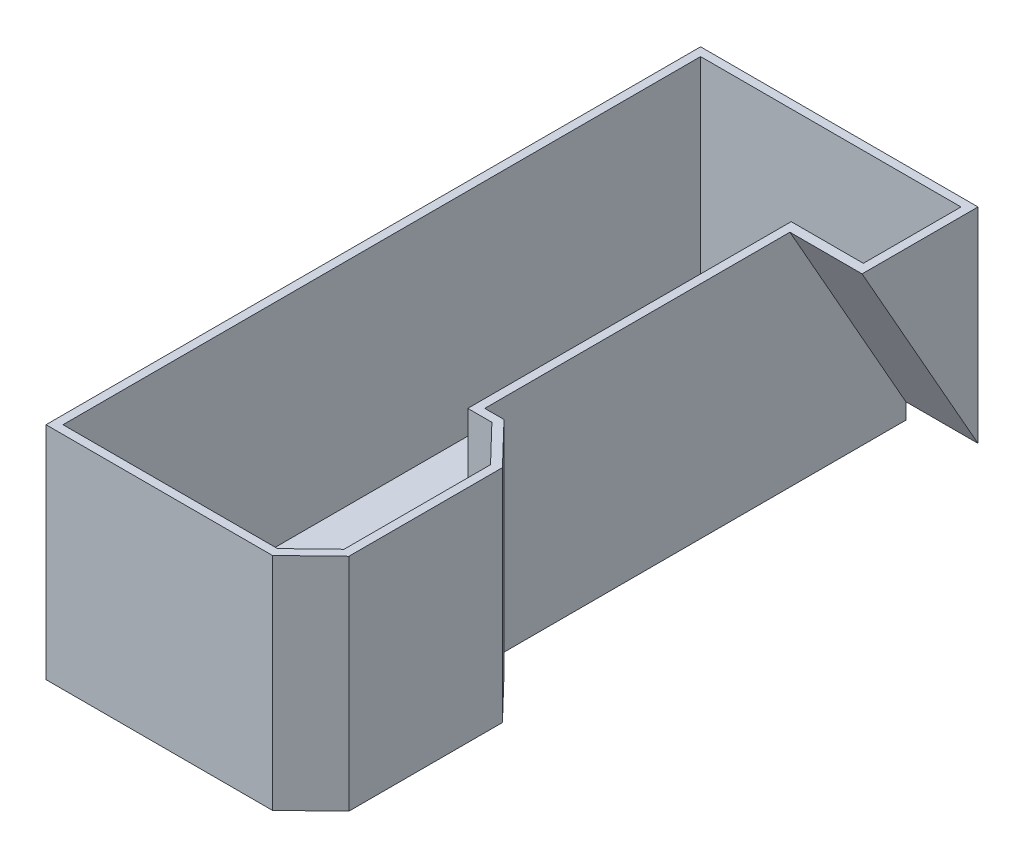
ISO-10303-21;
HEADER;
FILE_DESCRIPTION(('STEP AP214'),'2;1');
FILE_NAME('part.step','',(''),(''),'','','');
FILE_SCHEMA(('AUTOMOTIVE_DESIGN { 1 0 10303 214 1 1 1 1 }'));
ENDSEC;
DATA;
#1=APPLICATION_CONTEXT('core data for automotive mechanical design processes');
#2=APPLICATION_PROTOCOL_DEFINITION('international standard','automotive_design',2000,#1);
#3=PRODUCT_CONTEXT('',#1,'mechanical');
#4=PRODUCT('Part','Part','',(#3));
#5=PRODUCT_RELATED_PRODUCT_CATEGORY('part','',(#4));
#6=PRODUCT_DEFINITION_FORMATION('','',#4);
#7=PRODUCT_DEFINITION_CONTEXT('part definition',#1,'design');
#8=PRODUCT_DEFINITION('design','',#6,#7);
#9=PRODUCT_DEFINITION_SHAPE('','',#8);
#10=(LENGTH_UNIT() NAMED_UNIT(*) SI_UNIT(.MILLI.,.METRE.));
#11=(NAMED_UNIT(*) PLANE_ANGLE_UNIT() SI_UNIT($,.RADIAN.));
#12=(NAMED_UNIT(*) SI_UNIT($,.STERADIAN.) SOLID_ANGLE_UNIT());
#13=UNCERTAINTY_MEASURE_WITH_UNIT(LENGTH_MEASURE(1.E-05),#10,'distance_accuracy_value','');
#14=(GEOMETRIC_REPRESENTATION_CONTEXT(3) GLOBAL_UNCERTAINTY_ASSIGNED_CONTEXT((#13)) GLOBAL_UNIT_ASSIGNED_CONTEXT((#10,
#11,#12)) REPRESENTATION_CONTEXT('',''));
#15=CARTESIAN_POINT('',(0.,0.,0.));
#16=DIRECTION('',(0.,0.,1.));
#17=DIRECTION('',(1.,0.,0.));
#18=AXIS2_PLACEMENT_3D('',#15,#16,#17);
#19=CARTESIAN_POINT('',(278.,312.,-775.));
#20=DIRECTION('',(0.,-0.49259821985177,0.87025685507146));
#21=DIRECTION('',(0.,-0.87025685507146,-0.49259821985177));
#22=AXIS2_PLACEMENT_3D('',#19,#20,#21);
#23=PLANE('',#22);
#24=DIRECTION('',(-1.,0.,0.));
#25=VECTOR('',#24,1.);
#26=CARTESIAN_POINT('',(380.,68.2,-913.));
#27=LINE('',#26,#25);
#28=CARTESIAN_POINT('',(380.,68.2,-913.));
#29=VERTEX_POINT('',#28);
#30=CARTESIAN_POINT('',(278.,68.2,-913.));
#31=VERTEX_POINT('',#30);
#32=EDGE_CURVE('E56',#29,#31,#27,.T.);
#33=ORIENTED_EDGE('',*,*,#32,.T.);
#34=DIRECTION('',(0.,-0.87025685507146,-0.49259821985177));
#35=VECTOR('',#34,1.);
#36=CARTESIAN_POINT('',(278.,312.,-775.));
#37=LINE('',#36,#35);
#38=CARTESIAN_POINT('',(278.,312.,-775.));
#39=VERTEX_POINT('',#38);
#40=EDGE_CURVE('E217',#39,#31,#37,.T.);
#41=ORIENTED_EDGE('',*,*,#40,.F.);
#42=DIRECTION('',(1.,0.,0.));
#43=VECTOR('',#42,1.);
#44=CARTESIAN_POINT('',(278.,312.,-775.));
#45=LINE('',#44,#43);
#46=CARTESIAN_POINT('',(380.,312.,-775.));
#47=VERTEX_POINT('',#46);
#48=EDGE_CURVE('E219',#39,#47,#45,.T.);
#49=ORIENTED_EDGE('',*,*,#48,.T.);
#50=DIRECTION('',(0.,0.87025685507146,0.49259821985177));
#51=VECTOR('',#50,1.);
#52=CARTESIAN_POINT('',(380.,312.,-775.));
#53=LINE('',#52,#51);
#54=EDGE_CURVE('E190',#29,#47,#53,.T.);
#55=ORIENTED_EDGE('',*,*,#54,.F.);
#56=EDGE_LOOP('',(#33,#41,#49,#55));
#57=FACE_BOUND('',#56,.T.);
#58=ADVANCED_FACE('F41',(#57),#23,.F.);
#59=CARTESIAN_POINT('',(290.,12.,0.));
#60=DIRECTION('',(-1.,0.,0.));
#61=DIRECTION('',(0.,0.,1.));
#62=AXIS2_PLACEMENT_3D('',#59,#60,#61);
#63=PLANE('',#62);
#64=DIRECTION('',(0.,-0.87025685507146,-0.49259821985177));
#65=VECTOR('',#64,1.);
#66=CARTESIAN_POINT('',(290.,22.6393760342639,-925.));
#67=LINE('',#66,#65);
#68=CARTESIAN_POINT('',(290.,312.,-761.210967566564));
#69=VERTEX_POINT('',#68);
#70=CARTESIAN_POINT('',(290.,22.6393760342639,-925.));
#71=VERTEX_POINT('',#70);
#72=EDGE_CURVE('E186',#69,#71,#67,.T.);
#73=ORIENTED_EDGE('',*,*,#72,.F.);
#74=DIRECTION('',(0.,0.,-1.));
#75=VECTOR('',#74,1.);
#76=CARTESIAN_POINT('',(290.,312.,-330.));
#77=LINE('',#76,#75);
#78=CARTESIAN_POINT('',(290.,312.,-330.));
#79=VERTEX_POINT('',#78);
#80=EDGE_CURVE('E298',#79,#69,#77,.T.);
#81=ORIENTED_EDGE('',*,*,#80,.F.);
#82=DIRECTION('',(0.,1.,0.));
#83=VECTOR('',#82,1.);
#84=CARTESIAN_POINT('',(290.,0.,-330.));
#85=LINE('',#84,#83);
#86=CARTESIAN_POINT('',(290.,0.,-330.));
#87=VERTEX_POINT('',#86);
#88=EDGE_CURVE('E314',#87,#79,#85,.T.);
#89=ORIENTED_EDGE('',*,*,#88,.F.);
#90=DIRECTION('',(0.,0.,-1.));
#91=VECTOR('',#90,1.);
#92=CARTESIAN_POINT('',(290.,0.,0.));
#93=LINE('',#92,#91);
#94=CARTESIAN_POINT('',(290.,0.,-925.));
#95=VERTEX_POINT('',#94);
#96=EDGE_CURVE('E328',#87,#95,#93,.T.);
#97=ORIENTED_EDGE('',*,*,#96,.T.);
#98=DIRECTION('',(0.,-1.,0.));
#99=VECTOR('',#98,1.);
#100=CARTESIAN_POINT('',(290.,12.,-925.));
#101=LINE('',#100,#99);
#102=EDGE_CURVE('E49',#71,#95,#101,.T.);
#103=ORIENTED_EDGE('',*,*,#102,.F.);
#104=EDGE_LOOP('',(#73,#81,#89,#97,#103));
#105=FACE_BOUND('',#104,.T.);
#106=ADVANCED_FACE('F338',(#105),#63,.F.);
#107=CARTESIAN_POINT('',(0.,12.,0.));
#108=DIRECTION('',(1.,0.,0.));
#109=DIRECTION('',(0.,0.,-1.));
#110=AXIS2_PLACEMENT_3D('',#107,#108,#109);
#111=PLANE('',#110);
#112=DIRECTION('',(0.,0.,1.));
#113=VECTOR('',#112,1.);
#114=CARTESIAN_POINT('',(0.,0.,0.));
#115=LINE('',#114,#113);
#116=CARTESIAN_POINT('',(0.,0.,-925.));
#117=VERTEX_POINT('',#116);
#118=CARTESIAN_POINT('',(0.,0.,0.));
#119=VERTEX_POINT('',#118);
#120=EDGE_CURVE('E316',#117,#119,#115,.T.);
#121=ORIENTED_EDGE('',*,*,#120,.T.);
#122=DIRECTION('',(0.,-1.,0.));
#123=VECTOR('',#122,1.);
#124=CARTESIAN_POINT('',(0.,12.,0.));
#125=LINE('',#124,#123);
#126=CARTESIAN_POINT('',(0.,312.,0.));
#127=VERTEX_POINT('',#126);
#128=EDGE_CURVE('E11',#127,#119,#125,.T.);
#129=ORIENTED_EDGE('',*,*,#128,.F.);
#130=DIRECTION('',(0.,0.,1.));
#131=VECTOR('',#130,1.);
#132=CARTESIAN_POINT('',(0.,312.,-925.));
#133=LINE('',#132,#131);
#134=CARTESIAN_POINT('',(0.,312.,-925.));
#135=VERTEX_POINT('',#134);
#136=EDGE_CURVE('E280',#135,#127,#133,.T.);
#137=ORIENTED_EDGE('',*,*,#136,.F.);
#138=DIRECTION('',(0.,-1.,0.));
#139=VECTOR('',#138,1.);
#140=CARTESIAN_POINT('',(0.,12.,-925.));
#141=LINE('',#140,#139);
#142=EDGE_CURVE('E333',#135,#117,#141,.T.);
#143=ORIENTED_EDGE('',*,*,#142,.T.);
#144=EDGE_LOOP('',(#121,#129,#137,#143));
#145=FACE_BOUND('',#144,.T.);
#146=ADVANCED_FACE('F43',(#145),#111,.F.);
#147=CARTESIAN_POINT('',(0.,12.,0.));
#148=DIRECTION('',(0.,0.,-1.));
#149=DIRECTION('',(-1.,0.,0.));
#150=AXIS2_PLACEMENT_3D('',#147,#148,#149);
#151=PLANE('',#150);
#152=DIRECTION('',(1.,0.,0.));
#153=VECTOR('',#152,1.);
#154=CARTESIAN_POINT('',(0.,0.,0.));
#155=LINE('',#154,#153);
#156=CARTESIAN_POINT('',(320.,0.,0.));
#157=VERTEX_POINT('',#156);
#158=EDGE_CURVE('E326',#119,#157,#155,.T.);
#159=ORIENTED_EDGE('',*,*,#158,.T.);
#160=DIRECTION('',(0.,1.,0.));
#161=VECTOR('',#160,1.);
#162=CARTESIAN_POINT('',(320.,0.,0.));
#163=LINE('',#162,#161);
#164=CARTESIAN_POINT('',(320.,312.,0.));
#165=VERTEX_POINT('',#164);
#166=EDGE_CURVE('E313',#157,#165,#163,.T.);
#167=ORIENTED_EDGE('',*,*,#166,.T.);
#168=DIRECTION('',(1.,0.,0.));
#169=VECTOR('',#168,1.);
#170=CARTESIAN_POINT('',(0.,312.,0.));
#171=LINE('',#170,#169);
#172=EDGE_CURVE('E283',#127,#165,#171,.T.);
#173=ORIENTED_EDGE('',*,*,#172,.F.);
#174=ORIENTED_EDGE('',*,*,#128,.T.);
#175=EDGE_LOOP('',(#159,#167,#173,#174));
#176=FACE_BOUND('',#175,.T.);
#177=ADVANCED_FACE('F353',(#176),#151,.F.);
#178=CARTESIAN_POINT('',(0.,12.,-925.));
#179=DIRECTION('',(0.,0.,1.));
#180=DIRECTION('',(1.,0.,0.));
#181=AXIS2_PLACEMENT_3D('',#178,#179,#180);
#182=PLANE('',#181);
#183=DIRECTION('',(-1.,0.,0.));
#184=VECTOR('',#183,1.);
#185=CARTESIAN_POINT('',(290.,312.,-925.));
#186=LINE('',#185,#184);
#187=CARTESIAN_POINT('',(392.,312.,-925.));
#188=VERTEX_POINT('',#187);
#189=EDGE_CURVE('E196',#188,#135,#186,.T.);
#190=ORIENTED_EDGE('',*,*,#189,.F.);
#191=DIRECTION('',(0.,1.,0.));
#192=VECTOR('',#191,1.);
#193=CARTESIAN_POINT('',(392.,312.,-925.));
#194=LINE('',#193,#192);
#195=CARTESIAN_POINT('',(392.,22.6393760342638,-925.));
#196=VERTEX_POINT('',#195);
#197=EDGE_CURVE('E193',#196,#188,#194,.T.);
#198=ORIENTED_EDGE('',*,*,#197,.F.);
#199=DIRECTION('',(-1.,0.,0.));
#200=VECTOR('',#199,1.);
#201=CARTESIAN_POINT('',(380.,22.6393760342639,-925.));
#202=LINE('',#201,#200);
#203=EDGE_CURVE('E180',#196,#71,#202,.T.);
#204=ORIENTED_EDGE('',*,*,#203,.T.);
#205=ORIENTED_EDGE('',*,*,#102,.T.);
#206=DIRECTION('',(-1.,0.,0.));
#207=VECTOR('',#206,1.);
#208=CARTESIAN_POINT('',(0.,0.,-925.));
#209=LINE('',#208,#207);
#210=EDGE_CURVE('E331',#95,#117,#209,.T.);
#211=ORIENTED_EDGE('',*,*,#210,.T.);
#212=ORIENTED_EDGE('',*,*,#142,.F.);
#213=EDGE_LOOP('',(#190,#198,#204,#205,#211,#212));
#214=FACE_BOUND('',#213,.T.);
#215=ADVANCED_FACE('F194',(#214),#182,.F.);
#216=CARTESIAN_POINT('',(0.,0.,0.));
#217=DIRECTION('',(0.,-1.,0.));
#218=DIRECTION('',(0.,0.,-1.));
#219=AXIS2_PLACEMENT_3D('',#216,#217,#218);
#220=PLANE('',#219);
#221=ORIENTED_EDGE('',*,*,#120,.F.);
#222=ORIENTED_EDGE('',*,*,#210,.F.);
#223=ORIENTED_EDGE('',*,*,#96,.F.);
#224=DIRECTION('',(-1.,0.,0.));
#225=VECTOR('',#224,1.);
#226=CARTESIAN_POINT('',(290.,0.,-330.));
#227=LINE('',#226,#225);
#228=CARTESIAN_POINT('',(317.181818181818,0.,-330.));
#229=VERTEX_POINT('',#228);
#230=EDGE_CURVE('E310',#229,#87,#227,.T.);
#231=ORIENTED_EDGE('',*,*,#230,.F.);
#232=DIRECTION('',(-0.693893241040933,0.,-0.720077891646251));
#233=VECTOR('',#232,1.);
#234=CARTESIAN_POINT('',(317.181818181818,0.,-330.));
#235=LINE('',#234,#233);
#236=CARTESIAN_POINT('',(375.,0.,-270.));
#237=VERTEX_POINT('',#236);
#238=EDGE_CURVE('E307',#237,#229,#235,.T.);
#239=ORIENTED_EDGE('',*,*,#238,.F.);
#240=DIRECTION('',(0.,0.,-1.));
#241=VECTOR('',#240,1.);
#242=CARTESIAN_POINT('',(375.,0.,-270.));
#243=LINE('',#242,#241);
#244=CARTESIAN_POINT('',(375.,0.,-53.));
#245=VERTEX_POINT('',#244);
#246=EDGE_CURVE('E304',#245,#237,#243,.T.);
#247=ORIENTED_EDGE('',*,*,#246,.F.);
#248=DIRECTION('',(0.720077891646251,0.,-0.693893241040933));
#249=VECTOR('',#248,1.);
#250=CARTESIAN_POINT('',(375.,0.,-53.));
#251=LINE('',#250,#249);
#252=EDGE_CURVE('E301',#157,#245,#251,.T.);
#253=ORIENTED_EDGE('',*,*,#252,.F.);
#254=ORIENTED_EDGE('',*,*,#158,.F.);
#255=EDGE_LOOP('',(#221,#222,#223,#231,#239,#247,#253,#254));
#256=FACE_BOUND('',#255,.T.);
#257=ADVANCED_FACE('F343',(#256),#220,.T.);
#258=CARTESIAN_POINT('',(290.,0.,-330.));
#259=DIRECTION('',(0.,0.,-1.));
#260=DIRECTION('',(-1.,0.,0.));
#261=AXIS2_PLACEMENT_3D('',#258,#259,#260);
#262=PLANE('',#261);
#263=ORIENTED_EDGE('',*,*,#88,.T.);
#264=DIRECTION('',(-1.,0.,0.));
#265=VECTOR('',#264,1.);
#266=CARTESIAN_POINT('',(317.181818181818,312.,-330.));
#267=LINE('',#266,#265);
#268=CARTESIAN_POINT('',(317.181818181818,312.,-330.));
#269=VERTEX_POINT('',#268);
#270=EDGE_CURVE('E295',#269,#79,#267,.T.);
#271=ORIENTED_EDGE('',*,*,#270,.F.);
#272=DIRECTION('',(0.,1.,0.));
#273=VECTOR('',#272,1.);
#274=CARTESIAN_POINT('',(317.181818181818,0.,-330.));
#275=LINE('',#274,#273);
#276=EDGE_CURVE('E317',#229,#269,#275,.T.);
#277=ORIENTED_EDGE('',*,*,#276,.F.);
#278=ORIENTED_EDGE('',*,*,#230,.T.);
#279=EDGE_LOOP('',(#263,#271,#277,#278));
#280=FACE_BOUND('',#279,.T.);
#281=ADVANCED_FACE('F367',(#280),#262,.T.);
#282=CARTESIAN_POINT('',(317.181818181818,0.,-330.));
#283=DIRECTION('',(0.720077891646251,0.,-0.693893241040933));
#284=DIRECTION('',(-0.693893241040933,0.,-0.720077891646251));
#285=AXIS2_PLACEMENT_3D('',#282,#283,#284);
#286=PLANE('',#285);
#287=ORIENTED_EDGE('',*,*,#276,.T.);
#288=DIRECTION('',(-0.693893241040933,0.,-0.720077891646251));
#289=VECTOR('',#288,1.);
#290=CARTESIAN_POINT('',(375.,312.,-270.));
#291=LINE('',#290,#289);
#292=CARTESIAN_POINT('',(375.,312.,-270.));
#293=VERTEX_POINT('',#292);
#294=EDGE_CURVE('E292',#293,#269,#291,.T.);
#295=ORIENTED_EDGE('',*,*,#294,.F.);
#296=DIRECTION('',(0.,1.,0.));
#297=VECTOR('',#296,1.);
#298=CARTESIAN_POINT('',(375.,0.,-270.));
#299=LINE('',#298,#297);
#300=EDGE_CURVE('E319',#237,#293,#299,.T.);
#301=ORIENTED_EDGE('',*,*,#300,.F.);
#302=ORIENTED_EDGE('',*,*,#238,.T.);
#303=EDGE_LOOP('',(#287,#295,#301,#302));
#304=FACE_BOUND('',#303,.T.);
#305=ADVANCED_FACE('F365',(#304),#286,.T.);
#306=CARTESIAN_POINT('',(375.,0.,-270.));
#307=DIRECTION('',(1.,0.,0.));
#308=DIRECTION('',(0.,0.,-1.));
#309=AXIS2_PLACEMENT_3D('',#306,#307,#308);
#310=PLANE('',#309);
#311=ORIENTED_EDGE('',*,*,#300,.T.);
#312=DIRECTION('',(0.,0.,-1.));
#313=VECTOR('',#312,1.);
#314=CARTESIAN_POINT('',(375.,312.,-53.));
#315=LINE('',#314,#313);
#316=CARTESIAN_POINT('',(375.,312.,-53.));
#317=VERTEX_POINT('',#316);
#318=EDGE_CURVE('E289',#317,#293,#315,.T.);
#319=ORIENTED_EDGE('',*,*,#318,.F.);
#320=DIRECTION('',(0.,1.,0.));
#321=VECTOR('',#320,1.);
#322=CARTESIAN_POINT('',(375.,0.,-53.));
#323=LINE('',#322,#321);
#324=EDGE_CURVE('E321',#245,#317,#323,.T.);
#325=ORIENTED_EDGE('',*,*,#324,.F.);
#326=ORIENTED_EDGE('',*,*,#246,.T.);
#327=EDGE_LOOP('',(#311,#319,#325,#326));
#328=FACE_BOUND('',#327,.T.);
#329=ADVANCED_FACE('F360',(#328),#310,.T.);
#330=CARTESIAN_POINT('',(375.,0.,-53.));
#331=DIRECTION('',(0.693893241040933,0.,0.720077891646251));
#332=DIRECTION('',(0.720077891646251,0.,-0.693893241040933));
#333=AXIS2_PLACEMENT_3D('',#330,#331,#332);
#334=PLANE('',#333);
#335=ORIENTED_EDGE('',*,*,#324,.T.);
#336=DIRECTION('',(0.720077891646251,0.,-0.693893241040933));
#337=VECTOR('',#336,1.);
#338=CARTESIAN_POINT('',(320.,312.,0.));
#339=LINE('',#338,#337);
#340=EDGE_CURVE('E286',#165,#317,#339,.T.);
#341=ORIENTED_EDGE('',*,*,#340,.F.);
#342=ORIENTED_EDGE('',*,*,#166,.F.);
#343=ORIENTED_EDGE('',*,*,#252,.T.);
#344=EDGE_LOOP('',(#335,#341,#342,#343));
#345=FACE_BOUND('',#344,.T.);
#346=ADVANCED_FACE('F356',(#345),#334,.T.);
#347=CARTESIAN_POINT('',(0.,312.,0.));
#348=DIRECTION('',(0.,1.,0.));
#349=DIRECTION('',(0.,0.,1.));
#350=AXIS2_PLACEMENT_3D('',#347,#348,#349);
#351=PLANE('',#350);
#352=DIRECTION('',(-1.,0.,0.));
#353=VECTOR('',#352,1.);
#354=CARTESIAN_POINT('',(380.,312.,-761.210967566564));
#355=LINE('',#354,#353);
#356=CARTESIAN_POINT('',(392.,312.,-761.210967566564));
#357=VERTEX_POINT('',#356);
#358=EDGE_CURVE('E189',#357,#69,#355,.T.);
#359=ORIENTED_EDGE('',*,*,#358,.F.);
#360=DIRECTION('',(0.,0.,1.));
#361=VECTOR('',#360,1.);
#362=CARTESIAN_POINT('',(392.,312.,-761.210967566564));
#363=LINE('',#362,#361);
#364=EDGE_CURVE('E200',#188,#357,#363,.T.);
#365=ORIENTED_EDGE('',*,*,#364,.F.);
#366=ORIENTED_EDGE('',*,*,#189,.T.);
#367=ORIENTED_EDGE('',*,*,#136,.T.);
#368=ORIENTED_EDGE('',*,*,#172,.T.);
#369=ORIENTED_EDGE('',*,*,#340,.T.);
#370=ORIENTED_EDGE('',*,*,#318,.T.);
#371=ORIENTED_EDGE('',*,*,#294,.T.);
#372=ORIENTED_EDGE('',*,*,#270,.T.);
#373=ORIENTED_EDGE('',*,*,#80,.T.);
#374=EDGE_LOOP('',(#359,#365,#366,#367,#368,#369,#370,#371,#372,#373));
#375=FACE_BOUND('',#374,.T.);
#376=ORIENTED_EDGE('',*,*,#48,.F.);
#377=DIRECTION('',(0.,0.,-1.));
#378=VECTOR('',#377,1.);
#379=CARTESIAN_POINT('',(278.,312.,-318.));
#380=LINE('',#379,#378);
#381=CARTESIAN_POINT('',(278.,312.,-318.));
#382=VERTEX_POINT('',#381);
#383=EDGE_CURVE('E238',#382,#39,#380,.T.);
#384=ORIENTED_EDGE('',*,*,#383,.F.);
#385=DIRECTION('',(-1.,0.,0.));
#386=VECTOR('',#385,1.);
#387=CARTESIAN_POINT('',(312.080590731117,312.,-318.));
#388=LINE('',#387,#386);
#389=CARTESIAN_POINT('',(312.080590731117,312.,-318.));
#390=VERTEX_POINT('',#389);
#391=EDGE_CURVE('E235',#390,#382,#388,.T.);
#392=ORIENTED_EDGE('',*,*,#391,.F.);
#393=DIRECTION('',(-0.693893241040933,0.,-0.720077891646251));
#394=VECTOR('',#393,1.);
#395=CARTESIAN_POINT('',(363.,312.,-265.159103588895));
#396=LINE('',#395,#394);
#397=CARTESIAN_POINT('',(363.,312.,-265.159103588895));
#398=VERTEX_POINT('',#397);
#399=EDGE_CURVE('E233',#398,#390,#396,.T.);
#400=ORIENTED_EDGE('',*,*,#399,.F.);
#401=DIRECTION('',(0.,0.,-1.));
#402=VECTOR('',#401,1.);
#403=CARTESIAN_POINT('',(363.,312.,-58.1012274507011));
#404=LINE('',#403,#402);
#405=CARTESIAN_POINT('',(363.,312.,-58.1012274507011));
#406=VERTEX_POINT('',#405);
#407=EDGE_CURVE('E231',#406,#398,#404,.T.);
#408=ORIENTED_EDGE('',*,*,#407,.F.);
#409=DIRECTION('',(0.720077891646251,0.,-0.693893241040933));
#410=VECTOR('',#409,1.);
#411=CARTESIAN_POINT('',(315.159103588895,312.,-12.));
#412=LINE('',#411,#410);
#413=CARTESIAN_POINT('',(315.159103588895,312.,-12.));
#414=VERTEX_POINT('',#413);
#415=EDGE_CURVE('E229',#414,#406,#412,.T.);
#416=ORIENTED_EDGE('',*,*,#415,.F.);
#417=DIRECTION('',(1.,0.,0.));
#418=VECTOR('',#417,1.);
#419=CARTESIAN_POINT('',(12.,312.,-12.));
#420=LINE('',#419,#418);
#421=CARTESIAN_POINT('',(12.,312.,-12.));
#422=VERTEX_POINT('',#421);
#423=EDGE_CURVE('E227',#422,#414,#420,.T.);
#424=ORIENTED_EDGE('',*,*,#423,.F.);
#425=DIRECTION('',(0.,0.,1.));
#426=VECTOR('',#425,1.);
#427=CARTESIAN_POINT('',(12.,312.,-913.));
#428=LINE('',#427,#426);
#429=CARTESIAN_POINT('',(12.,312.,-913.));
#430=VERTEX_POINT('',#429);
#431=EDGE_CURVE('E224',#430,#422,#428,.T.);
#432=ORIENTED_EDGE('',*,*,#431,.F.);
#433=DIRECTION('',(-1.,0.,0.));
#434=VECTOR('',#433,1.);
#435=CARTESIAN_POINT('',(278.,312.,-913.));
#436=LINE('',#435,#434);
#437=CARTESIAN_POINT('',(380.,312.,-913.));
#438=VERTEX_POINT('',#437);
#439=EDGE_CURVE('E222',#438,#430,#436,.T.);
#440=ORIENTED_EDGE('',*,*,#439,.F.);
#441=DIRECTION('',(0.,0.,1.));
#442=VECTOR('',#441,1.);
#443=CARTESIAN_POINT('',(380.,312.,-761.210967566564));
#444=LINE('',#443,#442);
#445=EDGE_CURVE('E203',#438,#47,#444,.T.);
#446=ORIENTED_EDGE('',*,*,#445,.T.);
#447=EDGE_LOOP('',(#376,#384,#392,#400,#408,#416,#424,#432,#440,#446));
#448=FACE_BOUND('',#447,.T.);
#449=ADVANCED_FACE('F349',(#375,#448),#351,.T.);
#450=CARTESIAN_POINT('',(278.,312.,-913.));
#451=DIRECTION('',(0.,0.,1.));
#452=DIRECTION('',(1.,0.,0.));
#453=AXIS2_PLACEMENT_3D('',#450,#451,#452);
#454=PLANE('',#453);
#455=DIRECTION('',(-1.,0.,0.));
#456=VECTOR('',#455,1.);
#457=CARTESIAN_POINT('',(278.,12.,-913.));
#458=LINE('',#457,#456);
#459=CARTESIAN_POINT('',(278.,12.,-913.));
#460=VERTEX_POINT('',#459);
#461=CARTESIAN_POINT('',(12.,12.,-913.));
#462=VERTEX_POINT('',#461);
#463=EDGE_CURVE('E221',#460,#462,#458,.T.);
#464=ORIENTED_EDGE('',*,*,#463,.F.);
#465=DIRECTION('',(0.,-1.,0.));
#466=VECTOR('',#465,1.);
#467=CARTESIAN_POINT('',(278.,312.,-913.));
#468=LINE('',#467,#466);
#469=EDGE_CURVE('E63',#31,#460,#468,.T.);
#470=ORIENTED_EDGE('',*,*,#469,.F.);
#471=ORIENTED_EDGE('',*,*,#32,.F.);
#472=DIRECTION('',(0.,-1.,0.));
#473=VECTOR('',#472,1.);
#474=CARTESIAN_POINT('',(380.,68.2,-913.));
#475=LINE('',#474,#473);
#476=EDGE_CURVE('E208',#438,#29,#475,.T.);
#477=ORIENTED_EDGE('',*,*,#476,.F.);
#478=ORIENTED_EDGE('',*,*,#439,.T.);
#479=DIRECTION('',(0.,-1.,0.));
#480=VECTOR('',#479,1.);
#481=CARTESIAN_POINT('',(12.,312.,-913.));
#482=LINE('',#481,#480);
#483=EDGE_CURVE('E276',#430,#462,#482,.T.);
#484=ORIENTED_EDGE('',*,*,#483,.T.);
#485=EDGE_LOOP('',(#464,#470,#471,#477,#478,#484));
#486=FACE_BOUND('',#485,.T.);
#487=ADVANCED_FACE('F416',(#486),#454,.T.);
#488=CARTESIAN_POINT('',(12.,312.,-913.));
#489=DIRECTION('',(1.,0.,0.));
#490=DIRECTION('',(0.,0.,-1.));
#491=AXIS2_PLACEMENT_3D('',#488,#489,#490);
#492=PLANE('',#491);
#493=DIRECTION('',(0.,0.,1.));
#494=VECTOR('',#493,1.);
#495=CARTESIAN_POINT('',(12.,12.,-913.));
#496=LINE('',#495,#494);
#497=CARTESIAN_POINT('',(12.,12.,-12.));
#498=VERTEX_POINT('',#497);
#499=EDGE_CURVE('E243',#462,#498,#496,.T.);
#500=ORIENTED_EDGE('',*,*,#499,.F.);
#501=ORIENTED_EDGE('',*,*,#483,.F.);
#502=ORIENTED_EDGE('',*,*,#431,.T.);
#503=DIRECTION('',(0.,-1.,0.));
#504=VECTOR('',#503,1.);
#505=CARTESIAN_POINT('',(12.,312.,-12.));
#506=LINE('',#505,#504);
#507=EDGE_CURVE('E274',#422,#498,#506,.T.);
#508=ORIENTED_EDGE('',*,*,#507,.T.);
#509=EDGE_LOOP('',(#500,#501,#502,#508));
#510=FACE_BOUND('',#509,.T.);
#511=ADVANCED_FACE('F412',(#510),#492,.T.);
#512=CARTESIAN_POINT('',(12.,312.,-12.));
#513=DIRECTION('',(0.,0.,-1.));
#514=DIRECTION('',(-1.,0.,0.));
#515=AXIS2_PLACEMENT_3D('',#512,#513,#514);
#516=PLANE('',#515);
#517=DIRECTION('',(1.,0.,0.));
#518=VECTOR('',#517,1.);
#519=CARTESIAN_POINT('',(12.,12.,-12.));
#520=LINE('',#519,#518);
#521=CARTESIAN_POINT('',(315.159103588895,12.,-12.));
#522=VERTEX_POINT('',#521);
#523=EDGE_CURVE('E246',#498,#522,#520,.T.);
#524=ORIENTED_EDGE('',*,*,#523,.F.);
#525=ORIENTED_EDGE('',*,*,#507,.F.);
#526=ORIENTED_EDGE('',*,*,#423,.T.);
#527=DIRECTION('',(0.,-1.,0.));
#528=VECTOR('',#527,1.);
#529=CARTESIAN_POINT('',(315.159103588895,312.,-12.));
#530=LINE('',#529,#528);
#531=EDGE_CURVE('E272',#414,#522,#530,.T.);
#532=ORIENTED_EDGE('',*,*,#531,.T.);
#533=EDGE_LOOP('',(#524,#525,#526,#532));
#534=FACE_BOUND('',#533,.T.);
#535=ADVANCED_FACE('F408',(#534),#516,.T.);
#536=CARTESIAN_POINT('',(315.159103588895,312.,-12.));
#537=DIRECTION('',(-0.693893241040933,0.,-0.720077891646251));
#538=DIRECTION('',(-0.720077891646251,0.,0.693893241040933));
#539=AXIS2_PLACEMENT_3D('',#536,#537,#538);
#540=PLANE('',#539);
#541=DIRECTION('',(0.720077891646251,0.,-0.693893241040933));
#542=VECTOR('',#541,1.);
#543=CARTESIAN_POINT('',(315.159103588895,12.,-12.));
#544=LINE('',#543,#542);
#545=CARTESIAN_POINT('',(363.,12.,-58.1012274507011));
#546=VERTEX_POINT('',#545);
#547=EDGE_CURVE('E249',#522,#546,#544,.T.);
#548=ORIENTED_EDGE('',*,*,#547,.F.);
#549=ORIENTED_EDGE('',*,*,#531,.F.);
#550=ORIENTED_EDGE('',*,*,#415,.T.);
#551=DIRECTION('',(0.,-1.,0.));
#552=VECTOR('',#551,1.);
#553=CARTESIAN_POINT('',(363.,312.,-58.1012274507011));
#554=LINE('',#553,#552);
#555=EDGE_CURVE('E270',#406,#546,#554,.T.);
#556=ORIENTED_EDGE('',*,*,#555,.T.);
#557=EDGE_LOOP('',(#548,#549,#550,#556));
#558=FACE_BOUND('',#557,.T.);
#559=ADVANCED_FACE('F404',(#558),#540,.T.);
#560=CARTESIAN_POINT('',(363.,312.,-58.1012274507011));
#561=DIRECTION('',(-1.,0.,0.));
#562=DIRECTION('',(0.,0.,1.));
#563=AXIS2_PLACEMENT_3D('',#560,#561,#562);
#564=PLANE('',#563);
#565=DIRECTION('',(0.,0.,-1.));
#566=VECTOR('',#565,1.);
#567=CARTESIAN_POINT('',(363.,12.,-58.1012274507011));
#568=LINE('',#567,#566);
#569=CARTESIAN_POINT('',(363.,12.,-265.159103588895));
#570=VERTEX_POINT('',#569);
#571=EDGE_CURVE('E252',#546,#570,#568,.T.);
#572=ORIENTED_EDGE('',*,*,#571,.F.);
#573=ORIENTED_EDGE('',*,*,#555,.F.);
#574=ORIENTED_EDGE('',*,*,#407,.T.);
#575=DIRECTION('',(0.,-1.,0.));
#576=VECTOR('',#575,1.);
#577=CARTESIAN_POINT('',(363.,312.,-265.159103588895));
#578=LINE('',#577,#576);
#579=EDGE_CURVE('E268',#398,#570,#578,.T.);
#580=ORIENTED_EDGE('',*,*,#579,.T.);
#581=EDGE_LOOP('',(#572,#573,#574,#580));
#582=FACE_BOUND('',#581,.T.);
#583=ADVANCED_FACE('F400',(#582),#564,.T.);
#584=CARTESIAN_POINT('',(363.,312.,-265.159103588895));
#585=DIRECTION('',(-0.720077891646251,0.,0.693893241040933));
#586=DIRECTION('',(0.693893241040933,0.,0.720077891646251));
#587=AXIS2_PLACEMENT_3D('',#584,#585,#586);
#588=PLANE('',#587);
#589=DIRECTION('',(-0.693893241040933,0.,-0.720077891646251));
#590=VECTOR('',#589,1.);
#591=CARTESIAN_POINT('',(363.,12.,-265.159103588895));
#592=LINE('',#591,#590);
#593=CARTESIAN_POINT('',(312.080590731117,12.,-318.));
#594=VERTEX_POINT('',#593);
#595=EDGE_CURVE('E255',#570,#594,#592,.T.);
#596=ORIENTED_EDGE('',*,*,#595,.F.);
#597=ORIENTED_EDGE('',*,*,#579,.F.);
#598=ORIENTED_EDGE('',*,*,#399,.T.);
#599=DIRECTION('',(0.,-1.,0.));
#600=VECTOR('',#599,1.);
#601=CARTESIAN_POINT('',(312.080590731117,312.,-318.));
#602=LINE('',#601,#600);
#603=EDGE_CURVE('E266',#390,#594,#602,.T.);
#604=ORIENTED_EDGE('',*,*,#603,.T.);
#605=EDGE_LOOP('',(#596,#597,#598,#604));
#606=FACE_BOUND('',#605,.T.);
#607=ADVANCED_FACE('F396',(#606),#588,.T.);
#608=CARTESIAN_POINT('',(312.080590731117,312.,-318.));
#609=DIRECTION('',(0.,0.,1.));
#610=DIRECTION('',(1.,0.,0.));
#611=AXIS2_PLACEMENT_3D('',#608,#609,#610);
#612=PLANE('',#611);
#613=DIRECTION('',(-1.,0.,0.));
#614=VECTOR('',#613,1.);
#615=CARTESIAN_POINT('',(312.080590731117,12.,-318.));
#616=LINE('',#615,#614);
#617=CARTESIAN_POINT('',(278.,12.,-318.));
#618=VERTEX_POINT('',#617);
#619=EDGE_CURVE('E258',#594,#618,#616,.T.);
#620=ORIENTED_EDGE('',*,*,#619,.F.);
#621=ORIENTED_EDGE('',*,*,#603,.F.);
#622=ORIENTED_EDGE('',*,*,#391,.T.);
#623=DIRECTION('',(0.,-1.,0.));
#624=VECTOR('',#623,1.);
#625=CARTESIAN_POINT('',(278.,312.,-318.));
#626=LINE('',#625,#624);
#627=EDGE_CURVE('E264',#382,#618,#626,.T.);
#628=ORIENTED_EDGE('',*,*,#627,.T.);
#629=EDGE_LOOP('',(#620,#621,#622,#628));
#630=FACE_BOUND('',#629,.T.);
#631=ADVANCED_FACE('F393',(#630),#612,.T.);
#632=CARTESIAN_POINT('',(278.,312.,-318.));
#633=DIRECTION('',(-1.,0.,0.));
#634=DIRECTION('',(0.,0.,1.));
#635=AXIS2_PLACEMENT_3D('',#632,#633,#634);
#636=PLANE('',#635);
#637=ORIENTED_EDGE('',*,*,#40,.T.);
#638=ORIENTED_EDGE('',*,*,#469,.T.);
#639=DIRECTION('',(0.,0.,-1.));
#640=VECTOR('',#639,1.);
#641=CARTESIAN_POINT('',(278.,12.,-318.));
#642=LINE('',#641,#640);
#643=EDGE_CURVE('E225',#618,#460,#642,.T.);
#644=ORIENTED_EDGE('',*,*,#643,.F.);
#645=ORIENTED_EDGE('',*,*,#627,.F.);
#646=ORIENTED_EDGE('',*,*,#383,.T.);
#647=EDGE_LOOP('',(#637,#638,#644,#645,#646));
#648=FACE_BOUND('',#647,.T.);
#649=ADVANCED_FACE('F390',(#648),#636,.T.);
#650=CARTESIAN_POINT('',(0.,12.,0.));
#651=DIRECTION('',(0.,-1.,0.));
#652=DIRECTION('',(0.,0.,-1.));
#653=AXIS2_PLACEMENT_3D('',#650,#651,#652);
#654=PLANE('',#653);
#655=ORIENTED_EDGE('',*,*,#643,.T.);
#656=ORIENTED_EDGE('',*,*,#463,.T.);
#657=ORIENTED_EDGE('',*,*,#499,.T.);
#658=ORIENTED_EDGE('',*,*,#523,.T.);
#659=ORIENTED_EDGE('',*,*,#547,.T.);
#660=ORIENTED_EDGE('',*,*,#571,.T.);
#661=ORIENTED_EDGE('',*,*,#595,.T.);
#662=ORIENTED_EDGE('',*,*,#619,.T.);
#663=EDGE_LOOP('',(#655,#656,#657,#658,#659,#660,#661,#662));
#664=FACE_BOUND('',#663,.T.);
#665=ADVANCED_FACE('F392',(#664),#654,.F.);
#666=CARTESIAN_POINT('',(380.,22.6393760342639,-925.));
#667=DIRECTION('',(0.,0.49259821985177,-0.87025685507146));
#668=DIRECTION('',(0.,0.87025685507146,0.49259821985177));
#669=AXIS2_PLACEMENT_3D('',#666,#667,#668);
#670=PLANE('',#669);
#671=ORIENTED_EDGE('',*,*,#72,.T.);
#672=ORIENTED_EDGE('',*,*,#203,.F.);
#673=DIRECTION('',(0.,-0.87025685507146,-0.49259821985177));
#674=VECTOR('',#673,1.);
#675=CARTESIAN_POINT('',(392.,22.6393760342638,-925.));
#676=LINE('',#675,#674);
#677=EDGE_CURVE('E184',#357,#196,#676,.T.);
#678=ORIENTED_EDGE('',*,*,#677,.F.);
#679=ORIENTED_EDGE('',*,*,#358,.T.);
#680=EDGE_LOOP('',(#671,#672,#678,#679));
#681=FACE_BOUND('',#680,.T.);
#682=ADVANCED_FACE('F182',(#681),#670,.F.);
#683=CARTESIAN_POINT('',(392.,0.,0.));
#684=DIRECTION('',(-1.,0.,0.));
#685=DIRECTION('',(0.,0.,1.));
#686=AXIS2_PLACEMENT_3D('',#683,#684,#685);
#687=PLANE('',#686);
#688=ORIENTED_EDGE('',*,*,#677,.T.);
#689=ORIENTED_EDGE('',*,*,#197,.T.);
#690=ORIENTED_EDGE('',*,*,#364,.T.);
#691=EDGE_LOOP('',(#688,#689,#690));
#692=FACE_BOUND('',#691,.T.);
#693=ADVANCED_FACE('F202',(#692),#687,.F.);
#694=CARTESIAN_POINT('',(380.,0.,0.));
#695=DIRECTION('',(-1.,0.,0.));
#696=DIRECTION('',(0.,0.,1.));
#697=AXIS2_PLACEMENT_3D('',#694,#695,#696);
#698=PLANE('',#697);
#699=ORIENTED_EDGE('',*,*,#445,.F.);
#700=ORIENTED_EDGE('',*,*,#476,.T.);
#701=ORIENTED_EDGE('',*,*,#54,.T.);
#702=EDGE_LOOP('',(#699,#700,#701));
#703=FACE_BOUND('',#702,.T.);
#704=ADVANCED_FACE('F586',(#703),#698,.T.);
#705=CLOSED_SHELL('',(#58,#106,#146,#177,#215,#257,#281,#305,#329,#346,#449,#487,#511,#535,#559,
#583,#607,#631,#649,#665,#682,#693,#704));
#706=MANIFOLD_SOLID_BREP('B2',#705);
#707=ADVANCED_BREP_SHAPE_REPRESENTATION('',(#18,#706),#14);
#708=SHAPE_DEFINITION_REPRESENTATION(#9,#707);
ENDSEC;
END-ISO-10303-21;
